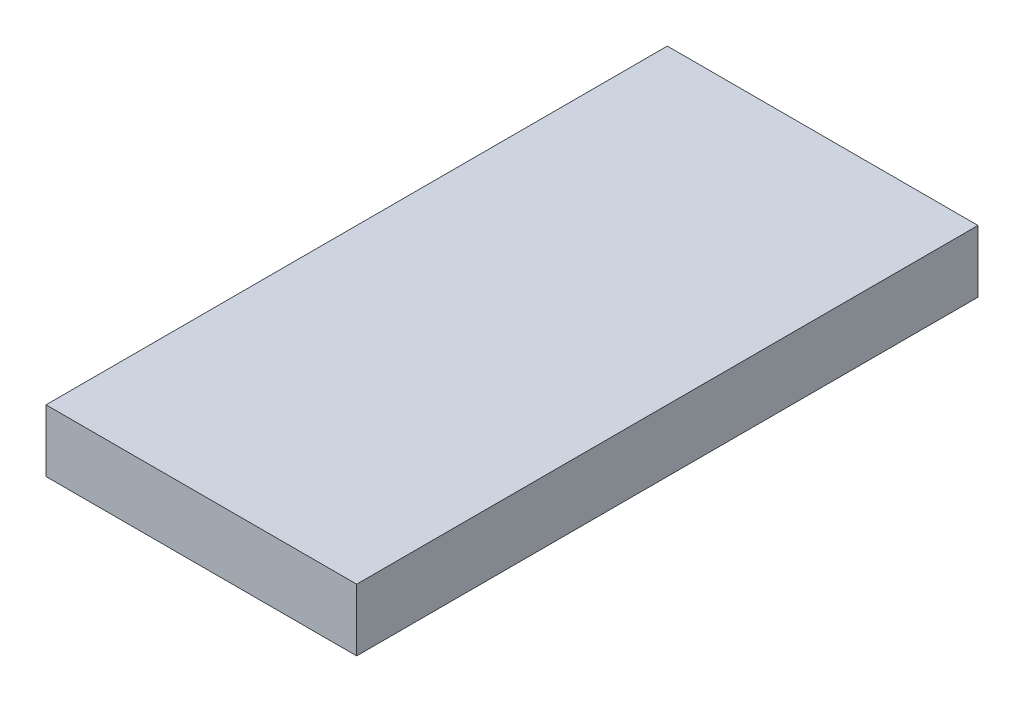
ISO-10303-21;
HEADER;
FILE_DESCRIPTION(('STEP AP214'),'2;1');
FILE_NAME('part.step','',(''),(''),'','','');
FILE_SCHEMA(('AUTOMOTIVE_DESIGN { 1 0 10303 214 1 1 1 1 }'));
ENDSEC;
DATA;
#1=APPLICATION_CONTEXT('core data for automotive mechanical design processes');
#2=APPLICATION_PROTOCOL_DEFINITION('international standard','automotive_design',2000,#1);
#3=PRODUCT_CONTEXT('',#1,'mechanical');
#4=PRODUCT('Part','Part','',(#3));
#5=PRODUCT_RELATED_PRODUCT_CATEGORY('part','',(#4));
#6=PRODUCT_DEFINITION_FORMATION('','',#4);
#7=PRODUCT_DEFINITION_CONTEXT('part definition',#1,'design');
#8=PRODUCT_DEFINITION('design','',#6,#7);
#9=PRODUCT_DEFINITION_SHAPE('','',#8);
#10=(LENGTH_UNIT() NAMED_UNIT(*) SI_UNIT(.MILLI.,.METRE.));
#11=(NAMED_UNIT(*) PLANE_ANGLE_UNIT() SI_UNIT($,.RADIAN.));
#12=(NAMED_UNIT(*) SI_UNIT($,.STERADIAN.) SOLID_ANGLE_UNIT());
#13=UNCERTAINTY_MEASURE_WITH_UNIT(LENGTH_MEASURE(1.E-05),#10,'distance_accuracy_value','');
#14=(GEOMETRIC_REPRESENTATION_CONTEXT(3) GLOBAL_UNCERTAINTY_ASSIGNED_CONTEXT((#13)) GLOBAL_UNIT_ASSIGNED_CONTEXT((#10,
#11,#12)) REPRESENTATION_CONTEXT('',''));
#15=CARTESIAN_POINT('',(0.,0.,0.));
#16=DIRECTION('',(0.,0.,1.));
#17=DIRECTION('',(1.,0.,0.));
#18=AXIS2_PLACEMENT_3D('',#15,#16,#17);
#19=CARTESIAN_POINT('',(-30.,12.,60.));
#20=DIRECTION('',(1.,0.,0.));
#21=DIRECTION('',(0.,0.,-1.));
#22=AXIS2_PLACEMENT_3D('',#19,#20,#21);
#23=PLANE('',#22);
#24=DIRECTION('',(0.,0.,1.));
#25=VECTOR('',#24,1.);
#26=CARTESIAN_POINT('',(-30.,0.,60.));
#27=LINE('',#26,#25);
#28=CARTESIAN_POINT('',(-30.,0.,-60.));
#29=VERTEX_POINT('',#28);
#30=CARTESIAN_POINT('',(-30.,0.,60.));
#31=VERTEX_POINT('',#30);
#32=EDGE_CURVE('E107',#29,#31,#27,.T.);
#33=ORIENTED_EDGE('',*,*,#32,.T.);
#34=DIRECTION('',(0.,-1.,0.));
#35=VECTOR('',#34,1.);
#36=CARTESIAN_POINT('',(-30.,12.,60.));
#37=LINE('',#36,#35);
#38=CARTESIAN_POINT('',(-30.,12.,60.));
#39=VERTEX_POINT('',#38);
#40=EDGE_CURVE('E11',#39,#31,#37,.T.);
#41=ORIENTED_EDGE('',*,*,#40,.F.);
#42=DIRECTION('',(0.,0.,1.));
#43=VECTOR('',#42,1.);
#44=CARTESIAN_POINT('',(-30.,12.,60.));
#45=LINE('',#44,#43);
#46=CARTESIAN_POINT('',(-30.,12.,-60.));
#47=VERTEX_POINT('',#46);
#48=EDGE_CURVE('E91',#47,#39,#45,.T.);
#49=ORIENTED_EDGE('',*,*,#48,.F.);
#50=DIRECTION('',(0.,-1.,0.));
#51=VECTOR('',#50,1.);
#52=CARTESIAN_POINT('',(-30.,12.,-60.));
#53=LINE('',#52,#51);
#54=EDGE_CURVE('E103',#47,#29,#53,.T.);
#55=ORIENTED_EDGE('',*,*,#54,.T.);
#56=EDGE_LOOP('',(#33,#41,#49,#55));
#57=FACE_BOUND('',#56,.T.);
#58=ADVANCED_FACE('F39',(#57),#23,.F.);
#59=CARTESIAN_POINT('',(30.,12.,60.));
#60=DIRECTION('',(0.,0.,-1.));
#61=DIRECTION('',(-1.,0.,0.));
#62=AXIS2_PLACEMENT_3D('',#59,#60,#61);
#63=PLANE('',#62);
#64=DIRECTION('',(1.,0.,0.));
#65=VECTOR('',#64,1.);
#66=CARTESIAN_POINT('',(30.,0.,60.));
#67=LINE('',#66,#65);
#68=CARTESIAN_POINT('',(30.,0.,60.));
#69=VERTEX_POINT('',#68);
#70=EDGE_CURVE('E96',#31,#69,#67,.T.);
#71=ORIENTED_EDGE('',*,*,#70,.T.);
#72=DIRECTION('',(0.,-1.,0.));
#73=VECTOR('',#72,1.);
#74=CARTESIAN_POINT('',(30.,12.,60.));
#75=LINE('',#74,#73);
#76=CARTESIAN_POINT('',(30.,12.,60.));
#77=VERTEX_POINT('',#76);
#78=EDGE_CURVE('E48',#77,#69,#75,.T.);
#79=ORIENTED_EDGE('',*,*,#78,.F.);
#80=DIRECTION('',(1.,0.,0.));
#81=VECTOR('',#80,1.);
#82=CARTESIAN_POINT('',(30.,12.,60.));
#83=LINE('',#82,#81);
#84=EDGE_CURVE('E86',#39,#77,#83,.T.);
#85=ORIENTED_EDGE('',*,*,#84,.F.);
#86=ORIENTED_EDGE('',*,*,#40,.T.);
#87=EDGE_LOOP('',(#71,#79,#85,#86));
#88=FACE_BOUND('',#87,.T.);
#89=ADVANCED_FACE('F95',(#88),#63,.F.);
#90=CARTESIAN_POINT('',(30.,12.,60.));
#91=DIRECTION('',(-1.,0.,0.));
#92=DIRECTION('',(0.,0.,1.));
#93=AXIS2_PLACEMENT_3D('',#90,#91,#92);
#94=PLANE('',#93);
#95=DIRECTION('',(0.,0.,-1.));
#96=VECTOR('',#95,1.);
#97=CARTESIAN_POINT('',(30.,0.,60.));
#98=LINE('',#97,#96);
#99=CARTESIAN_POINT('',(30.,0.,-60.));
#100=VERTEX_POINT('',#99);
#101=EDGE_CURVE('E73',#69,#100,#98,.T.);
#102=ORIENTED_EDGE('',*,*,#101,.T.);
#103=DIRECTION('',(0.,-1.,0.));
#104=VECTOR('',#103,1.);
#105=CARTESIAN_POINT('',(30.,12.,-60.));
#106=LINE('',#105,#104);
#107=CARTESIAN_POINT('',(30.,12.,-60.));
#108=VERTEX_POINT('',#107);
#109=EDGE_CURVE('E98',#108,#100,#106,.T.);
#110=ORIENTED_EDGE('',*,*,#109,.F.);
#111=DIRECTION('',(0.,0.,-1.));
#112=VECTOR('',#111,1.);
#113=CARTESIAN_POINT('',(30.,12.,60.));
#114=LINE('',#113,#112);
#115=EDGE_CURVE('E89',#77,#108,#114,.T.);
#116=ORIENTED_EDGE('',*,*,#115,.F.);
#117=ORIENTED_EDGE('',*,*,#78,.T.);
#118=EDGE_LOOP('',(#102,#110,#116,#117));
#119=FACE_BOUND('',#118,.T.);
#120=ADVANCED_FACE('F99',(#119),#94,.F.);
#121=CARTESIAN_POINT('',(30.,12.,-60.));
#122=DIRECTION('',(0.,0.,1.));
#123=DIRECTION('',(1.,0.,0.));
#124=AXIS2_PLACEMENT_3D('',#121,#122,#123);
#125=PLANE('',#124);
#126=DIRECTION('',(-1.,0.,0.));
#127=VECTOR('',#126,1.);
#128=CARTESIAN_POINT('',(30.,0.,-60.));
#129=LINE('',#128,#127);
#130=EDGE_CURVE('E79',#100,#29,#129,.T.);
#131=ORIENTED_EDGE('',*,*,#130,.T.);
#132=ORIENTED_EDGE('',*,*,#54,.F.);
#133=DIRECTION('',(-1.,0.,0.));
#134=VECTOR('',#133,1.);
#135=CARTESIAN_POINT('',(30.,12.,-60.));
#136=LINE('',#135,#134);
#137=EDGE_CURVE('E56',#108,#47,#136,.T.);
#138=ORIENTED_EDGE('',*,*,#137,.F.);
#139=ORIENTED_EDGE('',*,*,#109,.T.);
#140=EDGE_LOOP('',(#131,#132,#138,#139));
#141=FACE_BOUND('',#140,.T.);
#142=ADVANCED_FACE('F120',(#141),#125,.F.);
#143=CARTESIAN_POINT('',(0.,12.,0.));
#144=DIRECTION('',(0.,1.,0.));
#145=DIRECTION('',(0.,0.,1.));
#146=AXIS2_PLACEMENT_3D('',#143,#144,#145);
#147=PLANE('',#146);
#148=ORIENTED_EDGE('',*,*,#48,.T.);
#149=ORIENTED_EDGE('',*,*,#84,.T.);
#150=ORIENTED_EDGE('',*,*,#115,.T.);
#151=ORIENTED_EDGE('',*,*,#137,.T.);
#152=EDGE_LOOP('',(#148,#149,#150,#151));
#153=FACE_BOUND('',#152,.T.);
#154=ADVANCED_FACE('F87',(#153),#147,.T.);
#155=CARTESIAN_POINT('',(0.,0.,0.));
#156=DIRECTION('',(0.,1.,0.));
#157=DIRECTION('',(0.,0.,1.));
#158=AXIS2_PLACEMENT_3D('',#155,#156,#157);
#159=PLANE('',#158);
#160=ORIENTED_EDGE('',*,*,#32,.F.);
#161=ORIENTED_EDGE('',*,*,#130,.F.);
#162=ORIENTED_EDGE('',*,*,#101,.F.);
#163=ORIENTED_EDGE('',*,*,#70,.F.);
#164=EDGE_LOOP('',(#160,#161,#162,#163));
#165=FACE_BOUND('',#164,.T.);
#166=ADVANCED_FACE('F123',(#165),#159,.F.);
#167=CLOSED_SHELL('',(#58,#89,#120,#142,#154,#166));
#168=MANIFOLD_SOLID_BREP('B2',#167);
#169=ADVANCED_BREP_SHAPE_REPRESENTATION('',(#18,#168),#14);
#170=SHAPE_DEFINITION_REPRESENTATION(#9,#169);
ENDSEC;
END-ISO-10303-21;
